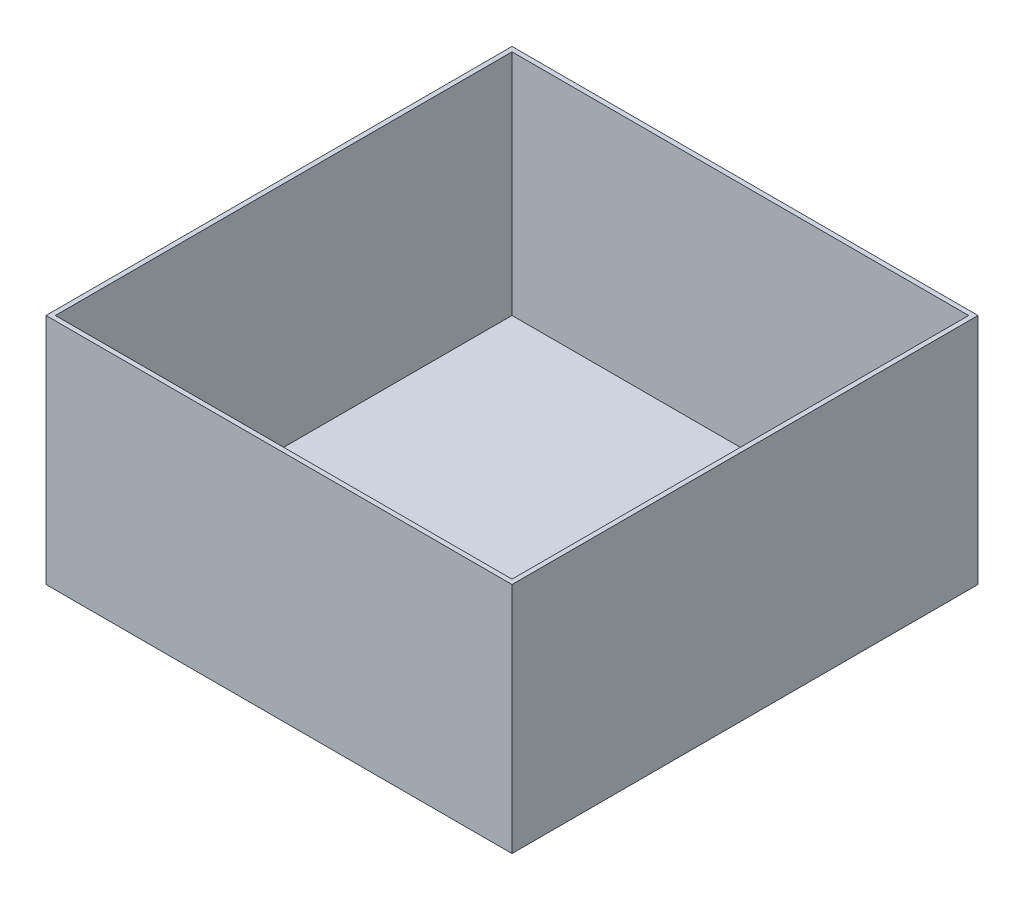
ISO-10303-21;
HEADER;
FILE_DESCRIPTION(('STEP AP214'),'2;1');
FILE_NAME('part.step','',(''),(''),'','','');
FILE_SCHEMA(('AUTOMOTIVE_DESIGN { 1 0 10303 214 1 1 1 1 }'));
ENDSEC;
DATA;
#1=APPLICATION_CONTEXT('core data for automotive mechanical design processes');
#2=APPLICATION_PROTOCOL_DEFINITION('international standard','automotive_design',2000,#1);
#3=PRODUCT_CONTEXT('',#1,'mechanical');
#4=PRODUCT('Part','Part','',(#3));
#5=PRODUCT_RELATED_PRODUCT_CATEGORY('part','',(#4));
#6=PRODUCT_DEFINITION_FORMATION('','',#4);
#7=PRODUCT_DEFINITION_CONTEXT('part definition',#1,'design');
#8=PRODUCT_DEFINITION('design','',#6,#7);
#9=PRODUCT_DEFINITION_SHAPE('','',#8);
#10=(LENGTH_UNIT() NAMED_UNIT(*) SI_UNIT(.MILLI.,.METRE.));
#11=(NAMED_UNIT(*) PLANE_ANGLE_UNIT() SI_UNIT($,.RADIAN.));
#12=(NAMED_UNIT(*) SI_UNIT($,.STERADIAN.) SOLID_ANGLE_UNIT());
#13=UNCERTAINTY_MEASURE_WITH_UNIT(LENGTH_MEASURE(1.E-05),#10,'distance_accuracy_value','');
#14=(GEOMETRIC_REPRESENTATION_CONTEXT(3) GLOBAL_UNCERTAINTY_ASSIGNED_CONTEXT((#13)) GLOBAL_UNIT_ASSIGNED_CONTEXT((#10,
#11,#12)) REPRESENTATION_CONTEXT('',''));
#15=CARTESIAN_POINT('',(0.,0.,0.));
#16=DIRECTION('',(0.,0.,1.));
#17=DIRECTION('',(1.,0.,0.));
#18=AXIS2_PLACEMENT_3D('',#15,#16,#17);
#19=CARTESIAN_POINT('',(500.,250.,1000.));
#20=DIRECTION('',(-1.,0.,0.));
#21=DIRECTION('',(0.,-1.,0.));
#22=AXIS2_PLACEMENT_3D('',#19,#20,#21);
#23=PLANE('',#22);
#24=DIRECTION('',(0.,1.,0.));
#25=VECTOR('',#24,1.);
#26=CARTESIAN_POINT('',(500.,250.,0.));
#27=LINE('',#26,#25);
#28=CARTESIAN_POINT('',(500.,-250.,0.));
#29=VERTEX_POINT('',#28);
#30=CARTESIAN_POINT('',(500.,250.,0.));
#31=VERTEX_POINT('',#30);
#32=EDGE_CURVE('E143',#29,#31,#27,.T.);
#33=ORIENTED_EDGE('',*,*,#32,.T.);
#34=DIRECTION('',(0.,0.,-1.));
#35=VECTOR('',#34,1.);
#36=CARTESIAN_POINT('',(500.,250.,1000.));
#37=LINE('',#36,#35);
#38=CARTESIAN_POINT('',(500.,250.,1000.));
#39=VERTEX_POINT('',#38);
#40=EDGE_CURVE('E11',#39,#31,#37,.T.);
#41=ORIENTED_EDGE('',*,*,#40,.F.);
#42=DIRECTION('',(0.,1.,0.));
#43=VECTOR('',#42,1.);
#44=CARTESIAN_POINT('',(500.,250.,1000.));
#45=LINE('',#44,#43);
#46=CARTESIAN_POINT('',(500.,-250.,1000.));
#47=VERTEX_POINT('',#46);
#48=EDGE_CURVE('E147',#47,#39,#45,.T.);
#49=ORIENTED_EDGE('',*,*,#48,.F.);
#50=DIRECTION('',(0.,0.,-1.));
#51=VECTOR('',#50,1.);
#52=CARTESIAN_POINT('',(500.,-250.,1000.));
#53=LINE('',#52,#51);
#54=EDGE_CURVE('E153',#47,#29,#53,.T.);
#55=ORIENTED_EDGE('',*,*,#54,.T.);
#56=EDGE_LOOP('',(#33,#41,#49,#55));
#57=FACE_BOUND('',#56,.T.);
#58=ADVANCED_FACE('F35',(#57),#23,.F.);
#59=CARTESIAN_POINT('',(-500.,250.,1000.));
#60=DIRECTION('',(0.,-1.,0.));
#61=DIRECTION('',(0.,0.,-1.));
#62=AXIS2_PLACEMENT_3D('',#59,#60,#61);
#63=PLANE('',#62);
#64=DIRECTION('',(-1.,0.,0.));
#65=VECTOR('',#64,1.);
#66=CARTESIAN_POINT('',(490.,250.,10.));
#67=LINE('',#66,#65);
#68=CARTESIAN_POINT('',(490.,250.,10.));
#69=VERTEX_POINT('',#68);
#70=CARTESIAN_POINT('',(-490.,250.,10.));
#71=VERTEX_POINT('',#70);
#72=EDGE_CURVE('E137',#69,#71,#67,.T.);
#73=ORIENTED_EDGE('',*,*,#72,.F.);
#74=DIRECTION('',(0.,0.,-1.));
#75=VECTOR('',#74,1.);
#76=CARTESIAN_POINT('',(490.,250.,990.));
#77=LINE('',#76,#75);
#78=CARTESIAN_POINT('',(490.,250.,990.));
#79=VERTEX_POINT('',#78);
#80=EDGE_CURVE('E49',#79,#69,#77,.T.);
#81=ORIENTED_EDGE('',*,*,#80,.F.);
#82=DIRECTION('',(1.,0.,0.));
#83=VECTOR('',#82,1.);
#84=CARTESIAN_POINT('',(-490.,250.,990.));
#85=LINE('',#84,#83);
#86=CARTESIAN_POINT('',(-490.,250.,990.));
#87=VERTEX_POINT('',#86);
#88=EDGE_CURVE('E128',#87,#79,#85,.T.);
#89=ORIENTED_EDGE('',*,*,#88,.F.);
#90=DIRECTION('',(0.,0.,1.));
#91=VECTOR('',#90,1.);
#92=CARTESIAN_POINT('',(-490.,250.,10.));
#93=LINE('',#92,#91);
#94=EDGE_CURVE('E131',#71,#87,#93,.T.);
#95=ORIENTED_EDGE('',*,*,#94,.F.);
#96=EDGE_LOOP('',(#73,#81,#89,#95));
#97=FACE_BOUND('',#96,.T.);
#98=DIRECTION('',(-1.,0.,0.));
#99=VECTOR('',#98,1.);
#100=CARTESIAN_POINT('',(-500.,250.,0.));
#101=LINE('',#100,#99);
#102=CARTESIAN_POINT('',(-500.,250.,0.));
#103=VERTEX_POINT('',#102);
#104=EDGE_CURVE('E156',#31,#103,#101,.T.);
#105=ORIENTED_EDGE('',*,*,#104,.T.);
#106=DIRECTION('',(0.,0.,-1.));
#107=VECTOR('',#106,1.);
#108=CARTESIAN_POINT('',(-500.,250.,1000.));
#109=LINE('',#108,#107);
#110=CARTESIAN_POINT('',(-500.,250.,1000.));
#111=VERTEX_POINT('',#110);
#112=EDGE_CURVE('E42',#111,#103,#109,.T.);
#113=ORIENTED_EDGE('',*,*,#112,.F.);
#114=DIRECTION('',(-1.,0.,0.));
#115=VECTOR('',#114,1.);
#116=CARTESIAN_POINT('',(-500.,250.,1000.));
#117=LINE('',#116,#115);
#118=EDGE_CURVE('E86',#39,#111,#117,.T.);
#119=ORIENTED_EDGE('',*,*,#118,.F.);
#120=ORIENTED_EDGE('',*,*,#40,.T.);
#121=EDGE_LOOP('',(#105,#113,#119,#120));
#122=FACE_BOUND('',#121,.T.);
#123=ADVANCED_FACE('F184',(#97,#122),#63,.F.);
#124=CARTESIAN_POINT('',(-500.,250.,1000.));
#125=DIRECTION('',(1.,0.,0.));
#126=DIRECTION('',(0.,1.,0.));
#127=AXIS2_PLACEMENT_3D('',#124,#125,#126);
#128=PLANE('',#127);
#129=DIRECTION('',(0.,-1.,0.));
#130=VECTOR('',#129,1.);
#131=CARTESIAN_POINT('',(-500.,250.,0.));
#132=LINE('',#131,#130);
#133=CARTESIAN_POINT('',(-500.,-250.,0.));
#134=VERTEX_POINT('',#133);
#135=EDGE_CURVE('E158',#103,#134,#132,.T.);
#136=ORIENTED_EDGE('',*,*,#135,.T.);
#137=DIRECTION('',(0.,0.,-1.));
#138=VECTOR('',#137,1.);
#139=CARTESIAN_POINT('',(-500.,-250.,1000.));
#140=LINE('',#139,#138);
#141=CARTESIAN_POINT('',(-500.,-250.,1000.));
#142=VERTEX_POINT('',#141);
#143=EDGE_CURVE('E162',#142,#134,#140,.T.);
#144=ORIENTED_EDGE('',*,*,#143,.F.);
#145=DIRECTION('',(0.,-1.,0.));
#146=VECTOR('',#145,1.);
#147=CARTESIAN_POINT('',(-500.,250.,1000.));
#148=LINE('',#147,#146);
#149=EDGE_CURVE('E150',#111,#142,#148,.T.);
#150=ORIENTED_EDGE('',*,*,#149,.F.);
#151=ORIENTED_EDGE('',*,*,#112,.T.);
#152=EDGE_LOOP('',(#136,#144,#150,#151));
#153=FACE_BOUND('',#152,.T.);
#154=ADVANCED_FACE('F167',(#153),#128,.F.);
#155=CARTESIAN_POINT('',(-500.,-250.,1000.));
#156=DIRECTION('',(0.,1.,0.));
#157=DIRECTION('',(0.,0.,1.));
#158=AXIS2_PLACEMENT_3D('',#155,#156,#157);
#159=PLANE('',#158);
#160=DIRECTION('',(1.,0.,0.));
#161=VECTOR('',#160,1.);
#162=CARTESIAN_POINT('',(-500.,-250.,0.));
#163=LINE('',#162,#161);
#164=EDGE_CURVE('E79',#134,#29,#163,.T.);
#165=ORIENTED_EDGE('',*,*,#164,.T.);
#166=ORIENTED_EDGE('',*,*,#54,.F.);
#167=DIRECTION('',(1.,0.,0.));
#168=VECTOR('',#167,1.);
#169=CARTESIAN_POINT('',(-500.,-250.,1000.));
#170=LINE('',#169,#168);
#171=EDGE_CURVE('E58',#142,#47,#170,.T.);
#172=ORIENTED_EDGE('',*,*,#171,.F.);
#173=ORIENTED_EDGE('',*,*,#143,.T.);
#174=EDGE_LOOP('',(#165,#166,#172,#173));
#175=FACE_BOUND('',#174,.T.);
#176=ADVANCED_FACE('F175',(#175),#159,.F.);
#177=CARTESIAN_POINT('',(0.,0.,1000.));
#178=DIRECTION('',(0.,0.,1.));
#179=DIRECTION('',(1.,0.,0.));
#180=AXIS2_PLACEMENT_3D('',#177,#178,#179);
#181=PLANE('',#180);
#182=ORIENTED_EDGE('',*,*,#48,.T.);
#183=ORIENTED_EDGE('',*,*,#118,.T.);
#184=ORIENTED_EDGE('',*,*,#149,.T.);
#185=ORIENTED_EDGE('',*,*,#171,.T.);
#186=EDGE_LOOP('',(#182,#183,#184,#185));
#187=FACE_BOUND('',#186,.T.);
#188=ADVANCED_FACE('F177',(#187),#181,.T.);
#189=CARTESIAN_POINT('',(0.,0.,0.));
#190=DIRECTION('',(0.,0.,1.));
#191=DIRECTION('',(1.,0.,0.));
#192=AXIS2_PLACEMENT_3D('',#189,#190,#191);
#193=PLANE('',#192);
#194=ORIENTED_EDGE('',*,*,#32,.F.);
#195=ORIENTED_EDGE('',*,*,#164,.F.);
#196=ORIENTED_EDGE('',*,*,#135,.F.);
#197=ORIENTED_EDGE('',*,*,#104,.F.);
#198=EDGE_LOOP('',(#194,#195,#196,#197));
#199=FACE_BOUND('',#198,.T.);
#200=ADVANCED_FACE('F171',(#199),#193,.F.);
#201=CARTESIAN_POINT('',(490.,-240.,990.));
#202=DIRECTION('',(1.,0.,0.));
#203=DIRECTION('',(0.,0.,-1.));
#204=AXIS2_PLACEMENT_3D('',#201,#202,#203);
#205=PLANE('',#204);
#206=ORIENTED_EDGE('',*,*,#80,.T.);
#207=DIRECTION('',(0.,1.,0.));
#208=VECTOR('',#207,1.);
#209=CARTESIAN_POINT('',(490.,-240.,10.));
#210=LINE('',#209,#208);
#211=CARTESIAN_POINT('',(490.,-240.,10.));
#212=VERTEX_POINT('',#211);
#213=EDGE_CURVE('E106',#212,#69,#210,.T.);
#214=ORIENTED_EDGE('',*,*,#213,.F.);
#215=DIRECTION('',(0.,0.,-1.));
#216=VECTOR('',#215,1.);
#217=CARTESIAN_POINT('',(490.,-240.,990.));
#218=LINE('',#217,#216);
#219=CARTESIAN_POINT('',(490.,-240.,990.));
#220=VERTEX_POINT('',#219);
#221=EDGE_CURVE('E110',#220,#212,#218,.T.);
#222=ORIENTED_EDGE('',*,*,#221,.F.);
#223=DIRECTION('',(0.,1.,0.));
#224=VECTOR('',#223,1.);
#225=CARTESIAN_POINT('',(490.,-240.,990.));
#226=LINE('',#225,#224);
#227=EDGE_CURVE('E141',#220,#79,#226,.T.);
#228=ORIENTED_EDGE('',*,*,#227,.T.);
#229=EDGE_LOOP('',(#206,#214,#222,#228));
#230=FACE_BOUND('',#229,.T.);
#231=ADVANCED_FACE('F108',(#230),#205,.F.);
#232=CARTESIAN_POINT('',(-490.,-240.,990.));
#233=DIRECTION('',(0.,0.,1.));
#234=DIRECTION('',(1.,0.,0.));
#235=AXIS2_PLACEMENT_3D('',#232,#233,#234);
#236=PLANE('',#235);
#237=ORIENTED_EDGE('',*,*,#88,.T.);
#238=ORIENTED_EDGE('',*,*,#227,.F.);
#239=DIRECTION('',(1.,0.,0.));
#240=VECTOR('',#239,1.);
#241=CARTESIAN_POINT('',(-490.,-240.,990.));
#242=LINE('',#241,#240);
#243=CARTESIAN_POINT('',(-490.,-240.,990.));
#244=VERTEX_POINT('',#243);
#245=EDGE_CURVE('E116',#244,#220,#242,.T.);
#246=ORIENTED_EDGE('',*,*,#245,.F.);
#247=DIRECTION('',(0.,1.,0.));
#248=VECTOR('',#247,1.);
#249=CARTESIAN_POINT('',(-490.,-240.,990.));
#250=LINE('',#249,#248);
#251=EDGE_CURVE('E144',#244,#87,#250,.T.);
#252=ORIENTED_EDGE('',*,*,#251,.T.);
#253=EDGE_LOOP('',(#237,#238,#246,#252));
#254=FACE_BOUND('',#253,.T.);
#255=ADVANCED_FACE('F199',(#254),#236,.F.);
#256=CARTESIAN_POINT('',(-490.,-240.,10.));
#257=DIRECTION('',(-1.,0.,0.));
#258=DIRECTION('',(0.,0.,1.));
#259=AXIS2_PLACEMENT_3D('',#256,#257,#258);
#260=PLANE('',#259);
#261=ORIENTED_EDGE('',*,*,#94,.T.);
#262=ORIENTED_EDGE('',*,*,#251,.F.);
#263=DIRECTION('',(0.,0.,1.));
#264=VECTOR('',#263,1.);
#265=CARTESIAN_POINT('',(-490.,-240.,10.));
#266=LINE('',#265,#264);
#267=CARTESIAN_POINT('',(-490.,-240.,10.));
#268=VERTEX_POINT('',#267);
#269=EDGE_CURVE('E124',#268,#244,#266,.T.);
#270=ORIENTED_EDGE('',*,*,#269,.F.);
#271=DIRECTION('',(0.,1.,0.));
#272=VECTOR('',#271,1.);
#273=CARTESIAN_POINT('',(-490.,-240.,10.));
#274=LINE('',#273,#272);
#275=EDGE_CURVE('E115',#268,#71,#274,.T.);
#276=ORIENTED_EDGE('',*,*,#275,.T.);
#277=EDGE_LOOP('',(#261,#262,#270,#276));
#278=FACE_BOUND('',#277,.T.);
#279=ADVANCED_FACE('F197',(#278),#260,.F.);
#280=CARTESIAN_POINT('',(490.,-240.,10.));
#281=DIRECTION('',(0.,0.,-1.));
#282=DIRECTION('',(-1.,0.,0.));
#283=AXIS2_PLACEMENT_3D('',#280,#281,#282);
#284=PLANE('',#283);
#285=ORIENTED_EDGE('',*,*,#72,.T.);
#286=ORIENTED_EDGE('',*,*,#275,.F.);
#287=DIRECTION('',(-1.,0.,0.));
#288=VECTOR('',#287,1.);
#289=CARTESIAN_POINT('',(490.,-240.,10.));
#290=LINE('',#289,#288);
#291=EDGE_CURVE('E119',#212,#268,#290,.T.);
#292=ORIENTED_EDGE('',*,*,#291,.F.);
#293=ORIENTED_EDGE('',*,*,#213,.T.);
#294=EDGE_LOOP('',(#285,#286,#292,#293));
#295=FACE_BOUND('',#294,.T.);
#296=ADVANCED_FACE('F120',(#295),#284,.F.);
#297=CARTESIAN_POINT('',(0.,-240.,0.));
#298=DIRECTION('',(0.,1.,0.));
#299=DIRECTION('',(0.,0.,1.));
#300=AXIS2_PLACEMENT_3D('',#297,#298,#299);
#301=PLANE('',#300);
#302=ORIENTED_EDGE('',*,*,#221,.T.);
#303=ORIENTED_EDGE('',*,*,#291,.T.);
#304=ORIENTED_EDGE('',*,*,#269,.T.);
#305=ORIENTED_EDGE('',*,*,#245,.T.);
#306=EDGE_LOOP('',(#302,#303,#304,#305));
#307=FACE_BOUND('',#306,.T.);
#308=ADVANCED_FACE('F126',(#307),#301,.T.);
#309=CLOSED_SHELL('',(#58,#123,#154,#176,#188,#200,#231,#255,#279,#296,#308));
#310=MANIFOLD_SOLID_BREP('B2',#309);
#311=ADVANCED_BREP_SHAPE_REPRESENTATION('',(#18,#310),#14);
#312=SHAPE_DEFINITION_REPRESENTATION(#9,#311);
ENDSEC;
END-ISO-10303-21;
